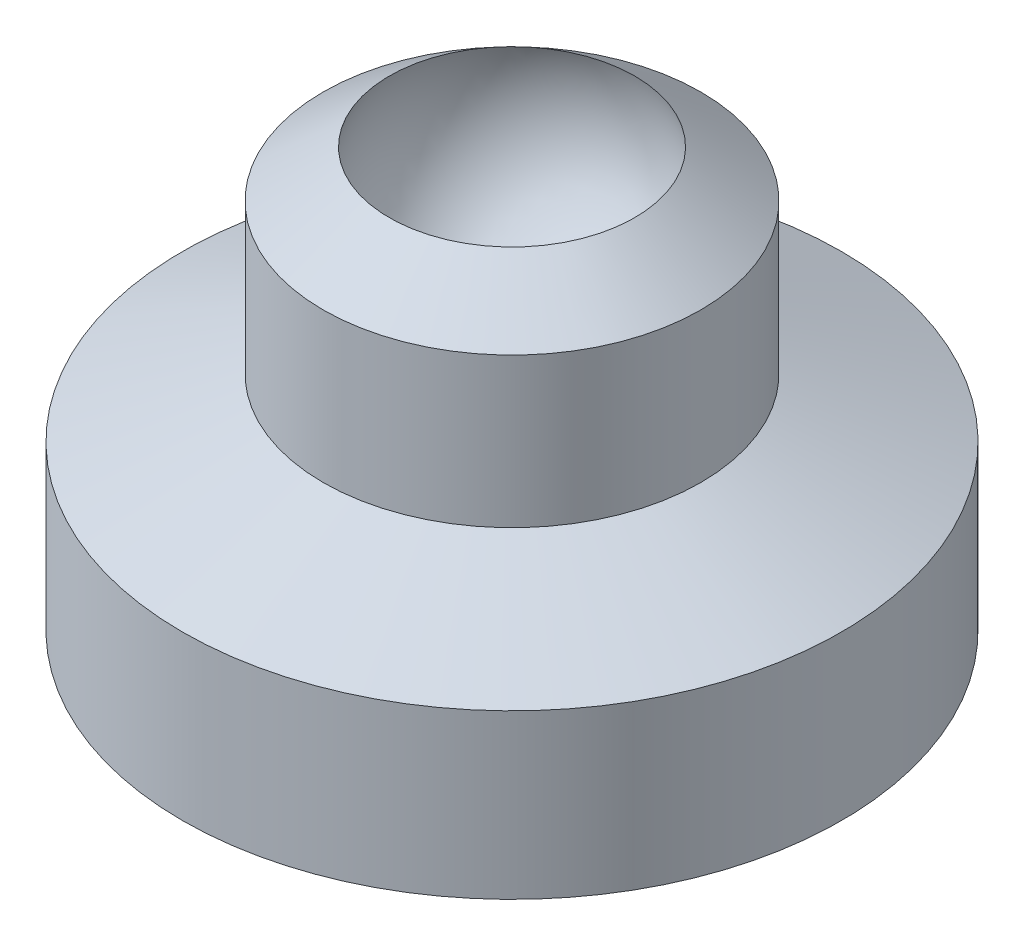
ISO-10303-21;
HEADER;
FILE_DESCRIPTION(('STEP AP214'),'2;1');
FILE_NAME('part.step','',(''),(''),'','','');
FILE_SCHEMA(('AUTOMOTIVE_DESIGN { 1 0 10303 214 1 1 1 1 }'));
ENDSEC;
DATA;
#1=APPLICATION_CONTEXT('core data for automotive mechanical design processes');
#2=APPLICATION_PROTOCOL_DEFINITION('international standard','automotive_design',2000,#1);
#3=PRODUCT_CONTEXT('',#1,'mechanical');
#4=PRODUCT('Part','Part','',(#3));
#5=PRODUCT_RELATED_PRODUCT_CATEGORY('part','',(#4));
#6=PRODUCT_DEFINITION_FORMATION('','',#4);
#7=PRODUCT_DEFINITION_CONTEXT('part definition',#1,'design');
#8=PRODUCT_DEFINITION('design','',#6,#7);
#9=PRODUCT_DEFINITION_SHAPE('','',#8);
#10=(LENGTH_UNIT() NAMED_UNIT(*) SI_UNIT(.MILLI.,.METRE.));
#11=(NAMED_UNIT(*) PLANE_ANGLE_UNIT() SI_UNIT($,.RADIAN.));
#12=(NAMED_UNIT(*) SI_UNIT($,.STERADIAN.) SOLID_ANGLE_UNIT());
#13=UNCERTAINTY_MEASURE_WITH_UNIT(LENGTH_MEASURE(1.E-05),#10,'distance_accuracy_value','');
#14=(GEOMETRIC_REPRESENTATION_CONTEXT(3) GLOBAL_UNCERTAINTY_ASSIGNED_CONTEXT((#13)) GLOBAL_UNIT_ASSIGNED_CONTEXT((#10,
#11,#12)) REPRESENTATION_CONTEXT('',''));
#15=CARTESIAN_POINT('',(0.,0.,0.));
#16=DIRECTION('',(0.,0.,1.));
#17=DIRECTION('',(1.,0.,0.));
#18=AXIS2_PLACEMENT_3D('',#15,#16,#17);
#19=CARTESIAN_POINT('',(0.,56.232806,345.479243));
#20=DIRECTION('',(0.,-1.,0.));
#21=DIRECTION('',(0.,0.,-1.));
#22=AXIS2_PLACEMENT_3D('',#19,#20,#21);
#23=SPHERICAL_SURFACE('',#22,19.866173527389);
#24=CARTESIAN_POINT('',(0.,63.317628,345.479243));
#25=DIRECTION('',(0.,-1.,0.));
#26=DIRECTION('',(0.,0.,-1.));
#27=AXIS2_PLACEMENT_3D('',#24,#25,#26);
#28=CIRCLE('',#27,18.559907);
#29=CARTESIAN_POINT('',(0.,63.317628,326.919336));
#30=VERTEX_POINT('',#29);
#31=EDGE_CURVE('E10',#30,#30,#28,.T.);
#32=ORIENTED_EDGE('',*,*,#31,.F.);
#33=EDGE_LOOP('',(#32));
#34=FACE_BOUND('',#33,.T.);
#35=ADVANCED_FACE('F31',(#34),#23,.F.);
#36=CARTESIAN_POINT('',(0.,63.317628,345.479243));
#37=DIRECTION('',(0.,-1.,0.));
#38=DIRECTION('',(0.,0.,-1.));
#39=AXIS2_PLACEMENT_3D('',#36,#37,#38);
#40=CONICAL_SURFACE('',#39,18.559907,0.953979724315841);
#41=CARTESIAN_POINT('',(0.,56.232806,345.479243));
#42=DIRECTION('',(0.,-1.,0.));
#43=DIRECTION('',(0.,0.,-1.));
#44=AXIS2_PLACEMENT_3D('',#41,#42,#43);
#45=CIRCLE('',#44,28.550997);
#46=CARTESIAN_POINT('',(0.,56.232806,316.928246));
#47=VERTEX_POINT('',#46);
#48=EDGE_CURVE('E37',#47,#47,#45,.T.);
#49=ORIENTED_EDGE('',*,*,#48,.F.);
#50=EDGE_LOOP('',(#49));
#51=FACE_BOUND('',#50,.T.);
#52=ORIENTED_EDGE('',*,*,#31,.T.);
#53=EDGE_LOOP('',(#52));
#54=FACE_BOUND('',#53,.T.);
#55=ADVANCED_FACE('F70',(#51,#54),#40,.T.);
#56=CARTESIAN_POINT('',(0.,0.,345.479243));
#57=DIRECTION('',(0.,-1.,0.));
#58=DIRECTION('',(0.,0.,-1.));
#59=AXIS2_PLACEMENT_3D('',#56,#57,#58);
#60=CYLINDRICAL_SURFACE('',#59,28.550997);
#61=CARTESIAN_POINT('',(0.,33.626806,345.479243));
#62=DIRECTION('',(0.,-1.,0.));
#63=DIRECTION('',(0.,0.,-1.));
#64=AXIS2_PLACEMENT_3D('',#61,#62,#63);
#65=CIRCLE('',#64,28.550997);
#66=CARTESIAN_POINT('',(0.,33.626806,316.928246));
#67=VERTEX_POINT('',#66);
#68=EDGE_CURVE('E41',#67,#67,#65,.T.);
#69=ORIENTED_EDGE('',*,*,#68,.F.);
#70=EDGE_LOOP('',(#69));
#71=FACE_BOUND('',#70,.T.);
#72=ORIENTED_EDGE('',*,*,#48,.T.);
#73=EDGE_LOOP('',(#72));
#74=FACE_BOUND('',#73,.T.);
#75=ADVANCED_FACE('F65',(#71,#74),#60,.T.);
#76=CARTESIAN_POINT('',(0.,33.626806,345.479243));
#77=DIRECTION('',(0.,-1.,0.));
#78=DIRECTION('',(0.,0.,-1.));
#79=AXIS2_PLACEMENT_3D('',#76,#77,#78);
#80=CONICAL_SURFACE('',#79,28.550997,1.17351228050393);
#81=CARTESIAN_POINT('',(0.,24.696166,345.479243));
#82=DIRECTION('',(0.,-1.,0.));
#83=DIRECTION('',(0.,0.,-1.));
#84=AXIS2_PLACEMENT_3D('',#81,#82,#83);
#85=CIRCLE('',#84,49.834927);
#86=CARTESIAN_POINT('',(0.,24.696166,295.644316));
#87=VERTEX_POINT('',#86);
#88=EDGE_CURVE('E45',#87,#87,#85,.T.);
#89=ORIENTED_EDGE('',*,*,#88,.F.);
#90=EDGE_LOOP('',(#89));
#91=FACE_BOUND('',#90,.T.);
#92=ORIENTED_EDGE('',*,*,#68,.T.);
#93=EDGE_LOOP('',(#92));
#94=FACE_BOUND('',#93,.T.);
#95=ADVANCED_FACE('F59',(#91,#94),#80,.T.);
#96=CARTESIAN_POINT('',(0.,0.,345.479243));
#97=DIRECTION('',(0.,-1.,0.));
#98=DIRECTION('',(0.,0.,-1.));
#99=AXIS2_PLACEMENT_3D('',#96,#97,#98);
#100=CYLINDRICAL_SURFACE('',#99,49.834927);
#101=CARTESIAN_POINT('',(0.,0.,345.479243));
#102=DIRECTION('',(0.,-1.,0.));
#103=DIRECTION('',(0.,0.,-1.));
#104=AXIS2_PLACEMENT_3D('',#101,#102,#103);
#105=CIRCLE('',#104,49.834927);
#106=CARTESIAN_POINT('',(0.,0.,295.644316));
#107=VERTEX_POINT('',#106);
#108=EDGE_CURVE('E50',#107,#107,#105,.T.);
#109=ORIENTED_EDGE('',*,*,#108,.F.);
#110=EDGE_LOOP('',(#109));
#111=FACE_BOUND('',#110,.T.);
#112=ORIENTED_EDGE('',*,*,#88,.T.);
#113=EDGE_LOOP('',(#112));
#114=FACE_BOUND('',#113,.T.);
#115=ADVANCED_FACE('F56',(#111,#114),#100,.T.);
#116=CARTESIAN_POINT('',(0.,0.,345.479243));
#117=DIRECTION('',(0.,1.,0.));
#118=DIRECTION('',(0.,0.,1.));
#119=AXIS2_PLACEMENT_3D('',#116,#117,#118);
#120=PLANE('',#119);
#121=ORIENTED_EDGE('',*,*,#108,.T.);
#122=EDGE_LOOP('',(#121));
#123=FACE_BOUND('',#122,.T.);
#124=ADVANCED_FACE('F54',(#123),#120,.F.);
#125=CLOSED_SHELL('',(#35,#55,#75,#95,#115,#124));
#126=MANIFOLD_SOLID_BREP('B2',#125);
#127=ADVANCED_BREP_SHAPE_REPRESENTATION('',(#18,#126),#14);
#128=SHAPE_DEFINITION_REPRESENTATION(#9,#127);
ENDSEC;
END-ISO-10303-21;
